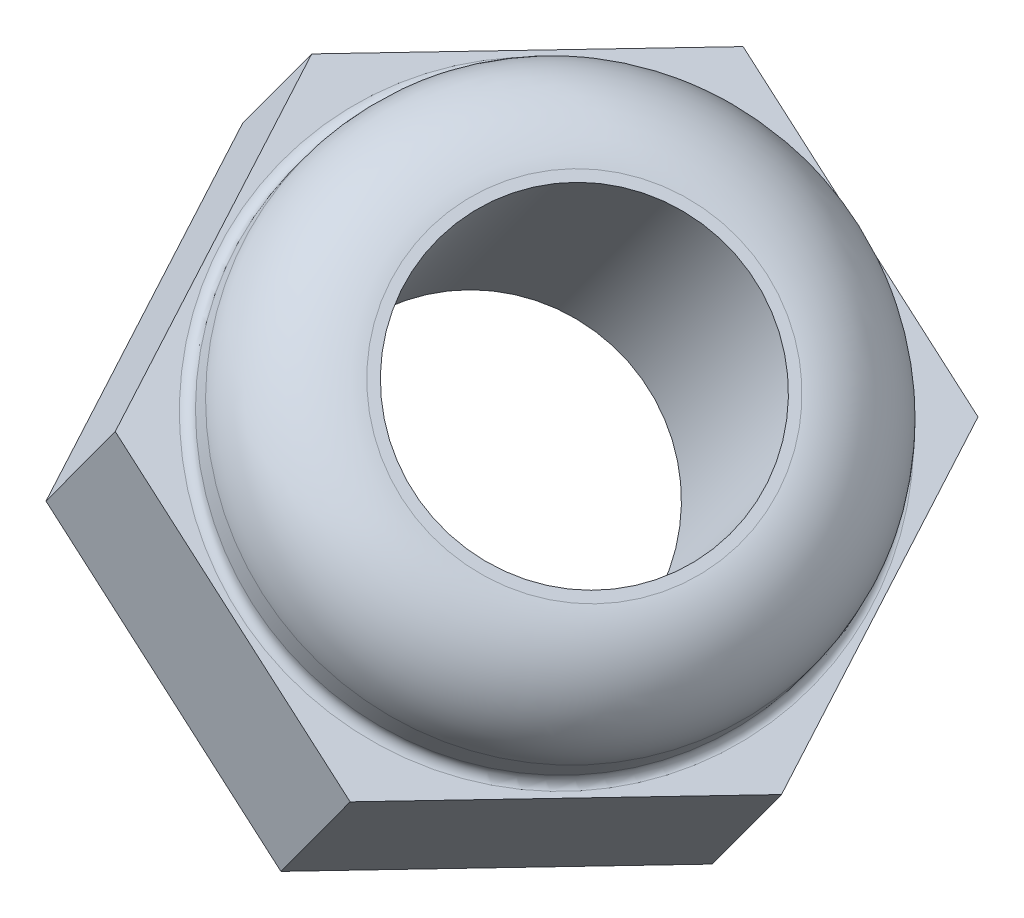
ISO-10303-21;
HEADER;
FILE_DESCRIPTION(('STEP AP214'),'2;1');
FILE_NAME('part.step','',(''),(''),'','','');
FILE_SCHEMA(('AUTOMOTIVE_DESIGN { 1 0 10303 214 1 1 1 1 }'));
ENDSEC;
DATA;
#1=APPLICATION_CONTEXT('core data for automotive mechanical design processes');
#2=APPLICATION_PROTOCOL_DEFINITION('international standard','automotive_design',2000,#1);
#3=PRODUCT_CONTEXT('',#1,'mechanical');
#4=PRODUCT('Part','Part','',(#3));
#5=PRODUCT_RELATED_PRODUCT_CATEGORY('part','',(#4));
#6=PRODUCT_DEFINITION_FORMATION('','',#4);
#7=PRODUCT_DEFINITION_CONTEXT('part definition',#1,'design');
#8=PRODUCT_DEFINITION('design','',#6,#7);
#9=PRODUCT_DEFINITION_SHAPE('','',#8);
#10=(LENGTH_UNIT() NAMED_UNIT(*) SI_UNIT(.MILLI.,.METRE.));
#11=(NAMED_UNIT(*) PLANE_ANGLE_UNIT() SI_UNIT($,.RADIAN.));
#12=(NAMED_UNIT(*) SI_UNIT($,.STERADIAN.) SOLID_ANGLE_UNIT());
#13=UNCERTAINTY_MEASURE_WITH_UNIT(LENGTH_MEASURE(1.E-05),#10,'distance_accuracy_value','');
#14=(GEOMETRIC_REPRESENTATION_CONTEXT(3) GLOBAL_UNCERTAINTY_ASSIGNED_CONTEXT((#13)) GLOBAL_UNIT_ASSIGNED_CONTEXT((#10,
#11,#12)) REPRESENTATION_CONTEXT('',''));
#15=CARTESIAN_POINT('',(0.,0.,0.));
#16=DIRECTION('',(0.,0.,1.));
#17=DIRECTION('',(1.,0.,0.));
#18=AXIS2_PLACEMENT_3D('',#15,#16,#17);
#19=CARTESIAN_POINT('',(-7.98571822976273,-1.24490551915185,57.2033640940937));
#20=DIRECTION('',(-0.611842920806837,-0.707106781183346,-0.35446895528817));
#21=DIRECTION('',(0.75620911516992,-0.654330019282263,0.));
#22=AXIS2_PLACEMENT_3D('',#19,#20,#21);
#23=CYLINDRICAL_SURFACE('',#22,1.49999999999013);
#24=CARTESIAN_POINT('',(-10.5860506431915,-4.25010933918077,55.6968710341191));
#25=DIRECTION('',(-0.611842920806837,-0.707106781183346,-0.35446895528817));
#26=DIRECTION('',(0.75620911516992,-0.654330019282263,0.));
#27=AXIS2_PLACEMENT_3D('',#24,#25,#26);
#28=CIRCLE('',#27,1.49999999999013);
#29=CARTESIAN_POINT('',(-9.45173697044411,-5.23160436809771,55.6968710341191));
#30=VERTEX_POINT('',#29);
#31=EDGE_CURVE('E105',#30,#30,#28,.T.);
#32=ORIENTED_EDGE('',*,*,#31,.T.);
#33=EDGE_LOOP('',(#32));
#34=FACE_BOUND('',#33,.T.);
#35=CARTESIAN_POINT('',(-7.98571822976273,-1.24490551915185,57.2033640940937));
#36=DIRECTION('',(-0.611842920806837,-0.707106781183346,-0.35446895528817));
#37=DIRECTION('',(0.75620911516992,-0.654330019282263,0.));
#38=AXIS2_PLACEMENT_3D('',#35,#36,#37);
#39=CIRCLE('',#38,1.49999999999013);
#40=CARTESIAN_POINT('',(-6.85140455701531,-2.22640054806878,57.2033640940937));
#41=VERTEX_POINT('',#40);
#42=EDGE_CURVE('E109',#41,#41,#39,.T.);
#43=ORIENTED_EDGE('',*,*,#42,.F.);
#44=EDGE_LOOP('',(#43));
#45=FACE_BOUND('',#44,.T.);
#46=ADVANCED_FACE('F17',(#34,#45),#23,.F.);
#47=CARTESIAN_POINT('',(-6.321707282252,-1.895384239648,55.62873986884));
#48=DIRECTION('',(0.611842920803868,0.707106781186699,0.354468955286605));
#49=DIRECTION('',(-0.756209115173027,0.654330019278672,0.));
#50=AXIS2_PLACEMENT_3D('',#47,#48,#49);
#51=PLANE('',#50);
#52=ORIENTED_EDGE('',*,*,#42,.T.);
#53=EDGE_LOOP('',(#52));
#54=FACE_BOUND('',#53,.T.);
#55=CARTESIAN_POINT('',(-7.98571822977814,-1.24490551913616,57.2033640940899));
#56=DIRECTION('',(-0.611842920802889,-0.707106781185872,-0.354468955289946));
#57=DIRECTION('',(0.756209115172759,-0.654330019278982,1.6436504934883E-12));
#58=AXIS2_PLACEMENT_3D('',#55,#56,#57);
#59=CIRCLE('',#58,1.59999999999973);
#60=CARTESIAN_POINT('',(-9.19565281405426,-0.197977488289894,57.2033640940863));
#61=VERTEX_POINT('',#60);
#62=CARTESIAN_POINT('',(-6.77578364550149,-2.2918335499819,57.2033640940895));
#63=VERTEX_POINT('',#62);
#64=EDGE_CURVE('E112',#61,#63,#59,.F.);
#65=ORIENTED_EDGE('',*,*,#64,.T.);
#66=CARTESIAN_POINT('',(-7.98571822977814,-1.24490551913616,57.2033640940899));
#67=DIRECTION('',(-0.611842920802889,-0.707106781185872,-0.354468955289946));
#68=DIRECTION('',(-0.756209115172805,0.654330019278929,-1.45716771982077E-12));
#69=AXIS2_PLACEMENT_3D('',#66,#67,#68);
#70=CIRCLE('',#69,1.59999999999973);
#71=EDGE_CURVE('E108',#63,#61,#70,.F.);
#72=ORIENTED_EDGE('',*,*,#71,.T.);
#73=EDGE_LOOP('',(#65,#72));
#74=FACE_BOUND('',#73,.T.);
#75=ADVANCED_FACE('F189',(#54,#74),#51,.T.);
#76=CARTESIAN_POINT('',(-7.395397201122,-5.670297346163,53.02257717331));
#77=DIRECTION('',(0.611842920803723,0.70710678118648,0.354468955287293));
#78=DIRECTION('',(-0.756209115173002,0.6543300192787,0.));
#79=AXIS2_PLACEMENT_3D('',#76,#77,#78);
#80=PLANE('',#79);
#81=ORIENTED_EDGE('',*,*,#31,.F.);
#82=EDGE_LOOP('',(#81));
#83=FACE_BOUND('',#82,.T.);
#84=DIRECTION('',(0.578970211180379,-0.0950246008278512,-0.809792454770514));
#85=VECTOR('',#84,1.);
#86=CARTESIAN_POINT('',(-9.10400286406026,-6.17701439252423,56.9825892364258));
#87=LINE('',#86,#85);
#88=CARTESIAN_POINT('',(-10.0232415340712,-6.02614257563793,58.2683074387387));
#89=VERTEX_POINT('',#88);
#90=CARTESIAN_POINT('',(-8.1847641941288,-6.32788620939661,55.6968710342319));
#91=VERTEX_POINT('',#90);
#92=EDGE_CURVE('E147',#89,#91,#87,.T.);
#93=ORIENTED_EDGE('',*,*,#92,.F.);
#94=DIRECTION('',(0.756209115173743,-0.654330019277845,0.));
#95=VECTOR('',#94,1.);
#96=CARTESIAN_POINT('',(-11.2238847586458,-4.98725414052223,58.2683074387408));
#97=LINE('',#96,#95);
#98=CARTESIAN_POINT('',(-12.4245279832191,-3.94836570540658,58.2683074387381));
#99=VERTEX_POINT('',#98);
#100=EDGE_CURVE('E151',#99,#89,#97,.T.);
#101=ORIENTED_EDGE('',*,*,#100,.F.);
#102=DIRECTION('',(0.177238903993861,-0.559305418449953,0.809792454770713));
#103=VECTOR('',#102,1.);
#104=CARTESIAN_POINT('',(-12.7059325377808,-3.06034908717723,56.9825892364258));
#105=LINE('',#104,#103);
#106=CARTESIAN_POINT('',(-12.9873370922595,-2.17233246896125,55.6968710339993));
#107=VERTEX_POINT('',#106);
#108=EDGE_CURVE('E85',#107,#99,#105,.T.);
#109=ORIENTED_EDGE('',*,*,#108,.F.);
#110=DIRECTION('',(-0.578970211180174,0.0950246008281642,0.809792454770624));
#111=VECTOR('',#110,1.);
#112=CARTESIAN_POINT('',(-12.0680984223308,-2.32320428583373,54.4111528318058));
#113=LINE('',#112,#111);
#114=CARTESIAN_POINT('',(-11.1488597523136,-2.4740761027204,53.1254346294924));
#115=VERTEX_POINT('',#114);
#116=EDGE_CURVE('E81',#115,#107,#113,.T.);
#117=ORIENTED_EDGE('',*,*,#116,.F.);
#118=DIRECTION('',(-0.756209115172996,0.654330019278708,0.));
#119=VECTOR('',#118,1.);
#120=CARTESIAN_POINT('',(-9.94821652773932,-3.51296453783574,53.1254346294908));
#121=LINE('',#120,#119);
#122=CARTESIAN_POINT('',(-8.74757330316586,-4.55185297295128,53.1254346294934));
#123=VERTEX_POINT('',#122);
#124=EDGE_CURVE('E156',#123,#115,#121,.T.);
#125=ORIENTED_EDGE('',*,*,#124,.F.);
#126=DIRECTION('',(-0.177238903992689,0.559305418450072,-0.809792454770887));
#127=VECTOR('',#126,1.);
#128=CARTESIAN_POINT('',(-8.46616874860579,-5.43986959118123,54.4111528318058));
#129=LINE('',#128,#127);
#130=EDGE_CURVE('E137',#91,#123,#129,.T.);
#131=ORIENTED_EDGE('',*,*,#130,.F.);
#132=EDGE_LOOP('',(#93,#101,#109,#117,#125,#131));
#133=FACE_BOUND('',#132,.T.);
#134=ADVANCED_FACE('F166',(#83,#133),#80,.F.);
#135=CARTESIAN_POINT('',(-8.59756115058103,-1.95201230032203,56.8488951388));
#136=DIRECTION('',(0.611842920802889,0.707106781185872,0.354468955289946));
#137=DIRECTION('',(-0.756209115173168,0.654330019278509,0.));
#138=AXIS2_PLACEMENT_3D('',#135,#136,#137);
#139=TOROIDAL_SURFACE('',#138,1.59999999999987,1.);
#140=ORIENTED_EDGE('',*,*,#64,.F.);
#141=ORIENTED_EDGE('',*,*,#71,.F.);
#142=EDGE_LOOP('',(#140,#141));
#143=FACE_BOUND('',#142,.T.);
#144=CARTESIAN_POINT('',(-8.59756115057972,-1.95201230032102,56.8488951387957));
#145=DIRECTION('',(0.611842920803081,0.707106781185934,0.35446895528949));
#146=DIRECTION('',(-0.75620911517379,0.654330019277791,2.80758322573342E-12));
#147=AXIS2_PLACEMENT_3D('',#144,#145,#146);
#148=CIRCLE('',#147,2.60000000000125);
#149=CARTESIAN_POINT('',(-10.5637048500325,-0.250754250197947,56.848895138803));
#150=VERTEX_POINT('',#149);
#151=EDGE_CURVE('E101',#150,#150,#148,.T.);
#152=ORIENTED_EDGE('',*,*,#151,.T.);
#153=EDGE_LOOP('',(#152));
#154=FACE_BOUND('',#153,.T.);
#155=ADVANCED_FACE('F161',(#143,#154),#139,.T.);
#156=CARTESIAN_POINT('',(-8.733198934827,-4.632299383321,53.10593883695));
#157=DIRECTION('',(0.23193967834656,0.26805265503378,-0.935067783499055));
#158=DIRECTION('',(-0.756209115172997,0.654330019278707,0.));
#159=AXIS2_PLACEMENT_3D('',#156,#157,#158);
#160=PLANE('',#159);
#161=ORIENTED_EDGE('',*,*,#124,.T.);
#162=DIRECTION('',(-0.611842920804029,-0.707106781186553,-0.354468955286619));
#163=VECTOR('',#162,1.);
#164=CARTESIAN_POINT('',(-10.3075757362106,-1.50180427858849,53.6128294430125));
#165=LINE('',#164,#163);
#166=CARTESIAN_POINT('',(-9.46629172010316,-0.529532454456345,54.1002242565342));
#167=VERTEX_POINT('',#166);
#168=EDGE_CURVE('E67',#167,#115,#165,.T.);
#169=ORIENTED_EDGE('',*,*,#168,.F.);
#170=DIRECTION('',(-0.756209115172969,0.654330019278739,0.));
#171=VECTOR('',#170,1.);
#172=CARTESIAN_POINT('',(-8.26564849552911,-1.56842088957253,54.1002242565348));
#173=LINE('',#172,#171);
#174=CARTESIAN_POINT('',(-7.06500527095555,-2.6073093246875,54.1002242565338));
#175=VERTEX_POINT('',#174);
#176=EDGE_CURVE('E99',#175,#167,#173,.T.);
#177=ORIENTED_EDGE('',*,*,#176,.F.);
#178=DIRECTION('',(0.611842920803824,0.707106781186687,0.354468955286705));
#179=VECTOR('',#178,1.);
#180=CARTESIAN_POINT('',(-7.90628928706105,-3.57958114882025,53.6128294430126));
#181=LINE('',#180,#179);
#182=EDGE_CURVE('E145',#123,#175,#181,.T.);
#183=ORIENTED_EDGE('',*,*,#182,.F.);
#184=EDGE_LOOP('',(#161,#169,#177,#183));
#185=FACE_BOUND('',#184,.T.);
#186=ADVANCED_FACE('F165',(#185),#160,.T.);
#187=CARTESIAN_POINT('',(-11.14574156616,-2.519001848361,53.05451010886));
#188=DIRECTION('',(-0.538926465139925,0.700692746671032,-0.467533891749455));
#189=DIRECTION('',(-0.578970211180174,0.0950246008281671,0.809792454770623));
#190=AXIS2_PLACEMENT_3D('',#187,#188,#189);
#191=PLANE('',#190);
#192=ORIENTED_EDGE('',*,*,#116,.T.);
#193=DIRECTION('',(-0.611842920803997,-0.707106781186588,-0.354468955286604));
#194=VECTOR('',#193,1.);
#195=CARTESIAN_POINT('',(-12.1460530762375,-1.20006064481602,56.1842658476325));
#196=LINE('',#195,#194);
#197=CARTESIAN_POINT('',(-11.3047690601298,-0.227788820683969,56.6716606611534));
#198=VERTEX_POINT('',#197);
#199=EDGE_CURVE('E73',#198,#107,#196,.T.);
#200=ORIENTED_EDGE('',*,*,#199,.F.);
#201=DIRECTION('',(-0.57897021118051,0.0950246008280584,0.809792454770396));
#202=VECTOR('',#201,1.);
#203=CARTESIAN_POINT('',(-9.46629172010256,-0.529532454457182,54.1002242565348));
#204=LINE('',#203,#202);
#205=EDGE_CURVE('E77',#167,#198,#204,.T.);
#206=ORIENTED_EDGE('',*,*,#205,.F.);
#207=ORIENTED_EDGE('',*,*,#168,.T.);
#208=EDGE_LOOP('',(#192,#200,#206,#207));
#209=FACE_BOUND('',#208,.T.);
#210=ADVANCED_FACE('F75',(#209),#191,.T.);
#211=CARTESIAN_POINT('',(-13.03224463517,-2.175702677184,55.62594651348));
#212=DIRECTION('',(-0.770866143486196,0.432640091637106,0.467533891750059));
#213=DIRECTION('',(0.177238903993862,-0.559305418449953,0.809792454770713));
#214=AXIS2_PLACEMENT_3D('',#211,#212,#213);
#215=PLANE('',#214);
#216=ORIENTED_EDGE('',*,*,#108,.T.);
#217=DIRECTION('',(-0.611842920804019,-0.70710678118655,-0.354468955286641));
#218=VECTOR('',#217,1.);
#219=CARTESIAN_POINT('',(-11.583243967117,-2.97609388127463,58.75570225226));
#220=LINE('',#219,#218);
#221=CARTESIAN_POINT('',(-10.741959951009,-2.00382205714291,59.2430970657761));
#222=VERTEX_POINT('',#221);
#223=EDGE_CURVE('E91',#222,#99,#220,.T.);
#224=ORIENTED_EDGE('',*,*,#223,.F.);
#225=DIRECTION('',(0.177238903992915,-0.559305418450976,0.809792454770214));
#226=VECTOR('',#225,1.);
#227=CARTESIAN_POINT('',(-11.3047690601293,-0.227788820684971,56.6716606611546));
#228=LINE('',#227,#226);
#229=EDGE_CURVE('E88',#198,#222,#228,.T.);
#230=ORIENTED_EDGE('',*,*,#229,.F.);
#231=ORIENTED_EDGE('',*,*,#199,.T.);
#232=EDGE_LOOP('',(#216,#224,#230,#231));
#233=FACE_BOUND('',#232,.T.);
#234=ADVANCED_FACE('F89',(#233),#215,.T.);
#235=CARTESIAN_POINT('',(-12.50620507285,-3.945701040967,58.2488116462));
#236=DIRECTION('',(-0.231939678346096,-0.268052655033871,0.935067783499144));
#237=DIRECTION('',(0.756209115173755,-0.654330019277831,0.));
#238=AXIS2_PLACEMENT_3D('',#235,#236,#237);
#239=PLANE('',#238);
#240=ORIENTED_EDGE('',*,*,#100,.T.);
#241=DIRECTION('',(-0.611842920804467,-0.707106781186242,-0.354468955286483));
#242=VECTOR('',#241,1.);
#243=CARTESIAN_POINT('',(-9.18195751796843,-5.05387075150644,58.7557022522575));
#244=LINE('',#243,#242);
#245=CARTESIAN_POINT('',(-8.34067350186213,-4.08159892737474,59.2430970657757));
#246=VERTEX_POINT('',#245);
#247=EDGE_CURVE('E150',#246,#89,#244,.T.);
#248=ORIENTED_EDGE('',*,*,#247,.F.);
#249=DIRECTION('',(0.756209115172763,-0.654330019278978,0.));
#250=VECTOR('',#249,1.);
#251=CARTESIAN_POINT('',(-9.54131672643439,-3.04271049225892,59.2430970657752));
#252=LINE('',#251,#250);
#253=EDGE_CURVE('E95',#222,#246,#252,.T.);
#254=ORIENTED_EDGE('',*,*,#253,.F.);
#255=ORIENTED_EDGE('',*,*,#223,.T.);
#256=EDGE_LOOP('',(#240,#248,#254,#255));
#257=FACE_BOUND('',#256,.T.);
#258=ADVANCED_FACE('F257',(#257),#239,.T.);
#259=CARTESIAN_POINT('',(-10.09366244152,-6.058998575928,58.30024037429));
#260=DIRECTION('',(0.538926465139708,-0.700692746671321,0.467533891749272));
#261=DIRECTION('',(0.578970211180391,-0.0950246008278507,-0.809792454770505));
#262=AXIS2_PLACEMENT_3D('',#259,#260,#261);
#263=PLANE('',#262);
#264=ORIENTED_EDGE('',*,*,#92,.T.);
#265=DIRECTION('',(-0.611842920803825,-0.707106781186689,-0.354468955286699));
#266=VECTOR('',#265,1.);
#267=CARTESIAN_POINT('',(-7.34348017793992,-5.35561438527883,56.1842658476375));
#268=LINE('',#267,#266);
#269=CARTESIAN_POINT('',(-6.50219616183484,-4.38334256114751,56.6716606611556));
#270=VERTEX_POINT('',#269);
#271=EDGE_CURVE('E146',#270,#91,#268,.T.);
#272=ORIENTED_EDGE('',*,*,#271,.F.);
#273=DIRECTION('',(0.578970211180564,-0.0950246008281285,-0.809792454770349));
#274=VECTOR('',#273,1.);
#275=CARTESIAN_POINT('',(-8.34067350186196,-4.08159892737473,59.243097065775));
#276=LINE('',#275,#274);
#277=EDGE_CURVE('E229',#246,#270,#276,.T.);
#278=ORIENTED_EDGE('',*,*,#277,.F.);
#279=ORIENTED_EDGE('',*,*,#247,.T.);
#280=EDGE_LOOP('',(#264,#272,#278,#279));
#281=FACE_BOUND('',#280,.T.);
#282=ADVANCED_FACE('F240',(#281),#263,.T.);
#283=CARTESIAN_POINT('',(-8.207159372507,-6.402297747105,55.72880396967));
#284=DIRECTION('',(0.770866143486497,-0.432640091637471,-0.467533891749225));
#285=DIRECTION('',(-0.177238903992689,0.559305418450073,-0.809792454770887));
#286=AXIS2_PLACEMENT_3D('',#283,#284,#285);
#287=PLANE('',#286);
#288=ORIENTED_EDGE('',*,*,#130,.T.);
#289=ORIENTED_EDGE('',*,*,#182,.T.);
#290=DIRECTION('',(-0.177238903992794,0.559305418450908,-0.809792454770287));
#291=VECTOR('',#290,1.);
#292=CARTESIAN_POINT('',(-6.50219616183483,-4.3833425611472,56.671660661155));
#293=LINE('',#292,#291);
#294=EDGE_CURVE('E236',#270,#175,#293,.T.);
#295=ORIENTED_EDGE('',*,*,#294,.F.);
#296=ORIENTED_EDGE('',*,*,#271,.T.);
#297=EDGE_LOOP('',(#288,#289,#295,#296));
#298=FACE_BOUND('',#297,.T.);
#299=ADVANCED_FACE('F246',(#298),#287,.T.);
#300=CARTESIAN_POINT('',(-8.8422983189025,-2.23485501279719,56.707107556679));
#301=DIRECTION('',(0.61184292080308,0.707106781185935,0.35446895528949));
#302=DIRECTION('',(-0.756209115173094,0.654330019278595,0.));
#303=AXIS2_PLACEMENT_3D('',#300,#301,#302);
#304=CYLINDRICAL_SURFACE('',#303,2.60000000000258);
#305=ORIENTED_EDGE('',*,*,#151,.F.);
#306=EDGE_LOOP('',(#305));
#307=FACE_BOUND('',#306,.T.);
#308=CARTESIAN_POINT('',(-8.84229831890282,-2.2348550127968,56.7071075566801));
#309=DIRECTION('',(0.611842920803085,0.707106781185942,0.354468955289466));
#310=DIRECTION('',(-0.756209115173085,0.654330019278606,0.));
#311=AXIS2_PLACEMENT_3D('',#308,#309,#310);
#312=CIRCLE('',#311,2.59999999999979);
#313=CARTESIAN_POINT('',(-10.8084420183527,-0.533596962672557,56.70710755668));
#314=VERTEX_POINT('',#313);
#315=EDGE_CURVE('E30',#314,#314,#312,.F.);
#316=ORIENTED_EDGE('',*,*,#315,.F.);
#317=EDGE_LOOP('',(#316));
#318=FACE_BOUND('',#317,.T.);
#319=ADVANCED_FACE('F129',(#307,#318),#304,.T.);
#320=CARTESIAN_POINT('',(-5.712829168912,-3.7257536979,53.99736680035));
#321=DIRECTION('',(0.611842920803755,0.707106781186452,0.354468955287293));
#322=DIRECTION('',(-0.756209115172973,0.654330019278734,0.));
#323=AXIS2_PLACEMENT_3D('',#320,#321,#322);
#324=PLANE('',#323);
#325=CARTESIAN_POINT('',(-8.90348261098314,-2.30556569091539,56.6716606611512));
#326=DIRECTION('',(0.611842920803085,0.707106781185942,0.354468955289466));
#327=DIRECTION('',(0.756209115173155,-0.654330019278524,-2.46716227694496E-13));
#328=AXIS2_PLACEMENT_3D('',#325,#326,#327);
#329=CIRCLE('',#328,2.69999999999981);
#330=CARTESIAN_POINT('',(-6.86171800001579,-4.07225674296754,56.6716606611523));
#331=VERTEX_POINT('',#330);
#332=CARTESIAN_POINT('',(-10.9452472219493,-0.538874638863477,56.671660661153));
#333=VERTEX_POINT('',#332);
#334=EDGE_CURVE('E11',#331,#333,#329,.T.);
#335=ORIENTED_EDGE('',*,*,#334,.F.);
#336=CARTESIAN_POINT('',(-8.90348261098314,-2.30556569091539,56.6716606611512));
#337=DIRECTION('',(0.611842920803085,0.707106781185942,0.354468955289466));
#338=DIRECTION('',(-0.756209115173107,0.654330019278579,0.));
#339=AXIS2_PLACEMENT_3D('',#336,#337,#338);
#340=CIRCLE('',#339,2.69999999999982);
#341=EDGE_CURVE('E37',#331,#333,#340,.F.);
#342=ORIENTED_EDGE('',*,*,#341,.T.);
#343=EDGE_LOOP('',(#335,#342));
#344=FACE_BOUND('',#343,.T.);
#345=ORIENTED_EDGE('',*,*,#277,.T.);
#346=ORIENTED_EDGE('',*,*,#294,.T.);
#347=ORIENTED_EDGE('',*,*,#176,.T.);
#348=ORIENTED_EDGE('',*,*,#205,.T.);
#349=ORIENTED_EDGE('',*,*,#229,.T.);
#350=ORIENTED_EDGE('',*,*,#253,.T.);
#351=EDGE_LOOP('',(#345,#346,#347,#348,#349,#350));
#352=FACE_BOUND('',#351,.T.);
#353=ADVANCED_FACE('F19',(#344,#352),#324,.T.);
#354=CARTESIAN_POINT('',(-8.84229831890283,-2.2348550127968,56.7071075566801));
#355=DIRECTION('',(0.611842920803085,0.707106781185942,0.354468955289466));
#356=DIRECTION('',(-0.756209115173085,0.654330019278605,0.));
#357=AXIS2_PLACEMENT_3D('',#354,#355,#356);
#358=TOROIDAL_SURFACE('',#357,2.69999999999979,0.1);
#359=ORIENTED_EDGE('',*,*,#315,.T.);
#360=EDGE_LOOP('',(#359));
#361=FACE_BOUND('',#360,.T.);
#362=ORIENTED_EDGE('',*,*,#334,.T.);
#363=ORIENTED_EDGE('',*,*,#341,.F.);
#364=EDGE_LOOP('',(#362,#363));
#365=FACE_BOUND('',#364,.T.);
#366=ADVANCED_FACE('F118',(#361,#365),#358,.F.);
#367=CLOSED_SHELL('',(#46,#75,#134,#155,#186,#210,#234,#258,#282,#299,#319,#353,#366));
#368=MANIFOLD_SOLID_BREP('B1',#367);
#369=ADVANCED_BREP_SHAPE_REPRESENTATION('',(#18,#368),#14);
#370=SHAPE_DEFINITION_REPRESENTATION(#9,#369);
ENDSEC;
END-ISO-10303-21;
